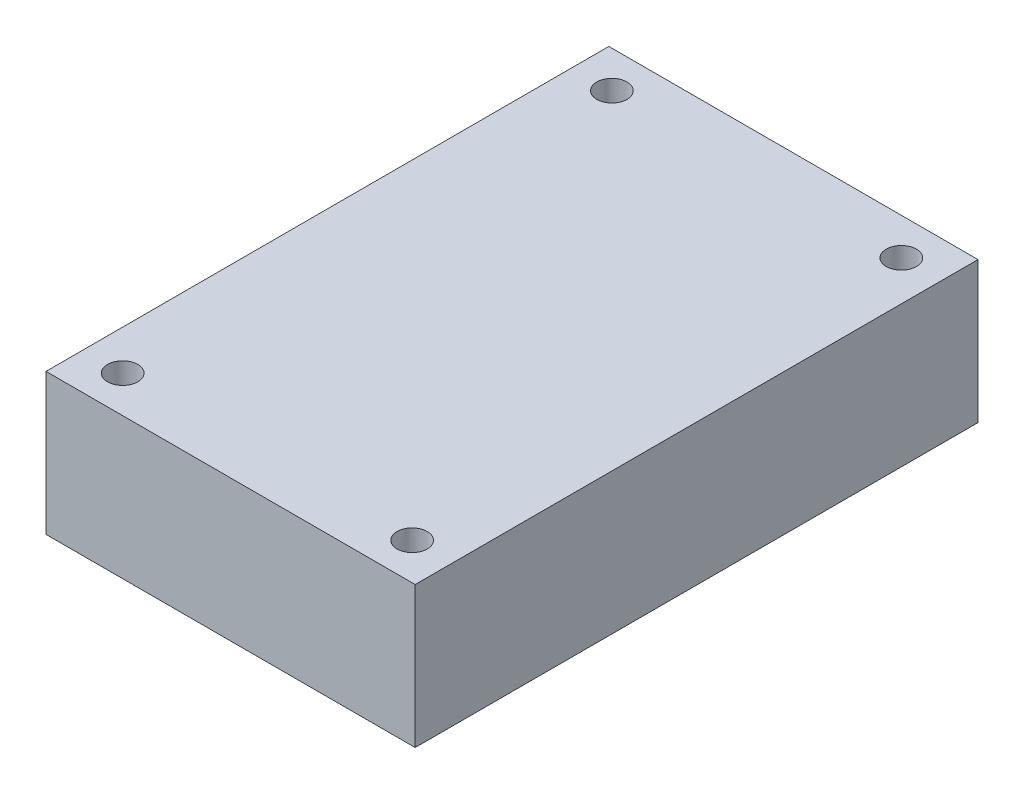
ISO-10303-21;
HEADER;
FILE_DESCRIPTION(('STEP AP214'),'2;1');
FILE_NAME('part.step','',(''),(''),'','','');
FILE_SCHEMA(('AUTOMOTIVE_DESIGN { 1 0 10303 214 1 1 1 1 }'));
ENDSEC;
DATA;
#1=APPLICATION_CONTEXT('core data for automotive mechanical design processes');
#2=APPLICATION_PROTOCOL_DEFINITION('international standard','automotive_design',2000,#1);
#3=PRODUCT_CONTEXT('',#1,'mechanical');
#4=PRODUCT('Part','Part','',(#3));
#5=PRODUCT_RELATED_PRODUCT_CATEGORY('part','',(#4));
#6=PRODUCT_DEFINITION_FORMATION('','',#4);
#7=PRODUCT_DEFINITION_CONTEXT('part definition',#1,'design');
#8=PRODUCT_DEFINITION('design','',#6,#7);
#9=PRODUCT_DEFINITION_SHAPE('','',#8);
#10=(LENGTH_UNIT() NAMED_UNIT(*) SI_UNIT(.MILLI.,.METRE.));
#11=(NAMED_UNIT(*) PLANE_ANGLE_UNIT() SI_UNIT($,.RADIAN.));
#12=(NAMED_UNIT(*) SI_UNIT($,.STERADIAN.) SOLID_ANGLE_UNIT());
#13=UNCERTAINTY_MEASURE_WITH_UNIT(LENGTH_MEASURE(1.E-05),#10,'distance_accuracy_value','');
#14=(GEOMETRIC_REPRESENTATION_CONTEXT(3) GLOBAL_UNCERTAINTY_ASSIGNED_CONTEXT((#13)) GLOBAL_UNIT_ASSIGNED_CONTEXT((#10,
#11,#12)) REPRESENTATION_CONTEXT('',''));
#15=CARTESIAN_POINT('',(0.,0.,0.));
#16=DIRECTION('',(0.,0.,1.));
#17=DIRECTION('',(1.,0.,0.));
#18=AXIS2_PLACEMENT_3D('',#15,#16,#17);
#19=CARTESIAN_POINT('',(18.3,14.,-27.9));
#20=DIRECTION('',(-1.,0.,0.));
#21=DIRECTION('',(0.,0.,1.));
#22=AXIS2_PLACEMENT_3D('',#19,#20,#21);
#23=PLANE('',#22);
#24=DIRECTION('',(0.,0.,-1.));
#25=VECTOR('',#24,1.);
#26=CARTESIAN_POINT('',(18.3,0.,-27.9));
#27=LINE('',#26,#25);
#28=CARTESIAN_POINT('',(18.3,0.,27.9));
#29=VERTEX_POINT('',#28);
#30=CARTESIAN_POINT('',(18.3,0.,-27.9));
#31=VERTEX_POINT('',#30);
#32=EDGE_CURVE('E104',#29,#31,#27,.T.);
#33=ORIENTED_EDGE('',*,*,#32,.T.);
#34=DIRECTION('',(0.,-1.,0.));
#35=VECTOR('',#34,1.);
#36=CARTESIAN_POINT('',(18.3,14.,-27.9));
#37=LINE('',#36,#35);
#38=CARTESIAN_POINT('',(18.3,14.,-27.9));
#39=VERTEX_POINT('',#38);
#40=EDGE_CURVE('E11',#39,#31,#37,.T.);
#41=ORIENTED_EDGE('',*,*,#40,.F.);
#42=DIRECTION('',(0.,0.,-1.));
#43=VECTOR('',#42,1.);
#44=CARTESIAN_POINT('',(18.3,14.,-27.9));
#45=LINE('',#44,#43);
#46=CARTESIAN_POINT('',(18.3,14.,27.9));
#47=VERTEX_POINT('',#46);
#48=EDGE_CURVE('E92',#47,#39,#45,.T.);
#49=ORIENTED_EDGE('',*,*,#48,.F.);
#50=DIRECTION('',(0.,-1.,0.));
#51=VECTOR('',#50,1.);
#52=CARTESIAN_POINT('',(18.3,14.,27.9));
#53=LINE('',#52,#51);
#54=EDGE_CURVE('E100',#47,#29,#53,.T.);
#55=ORIENTED_EDGE('',*,*,#54,.T.);
#56=EDGE_LOOP('',(#33,#41,#49,#55));
#57=FACE_BOUND('',#56,.T.);
#58=ADVANCED_FACE('F41',(#57),#23,.F.);
#59=CARTESIAN_POINT('',(-18.3,14.,-27.9));
#60=DIRECTION('',(0.,0.,1.));
#61=DIRECTION('',(1.,0.,0.));
#62=AXIS2_PLACEMENT_3D('',#59,#60,#61);
#63=PLANE('',#62);
#64=DIRECTION('',(-1.,0.,0.));
#65=VECTOR('',#64,1.);
#66=CARTESIAN_POINT('',(-18.3,0.,-27.9));
#67=LINE('',#66,#65);
#68=CARTESIAN_POINT('',(-18.3,0.,-27.9));
#69=VERTEX_POINT('',#68);
#70=EDGE_CURVE('E96',#31,#69,#67,.T.);
#71=ORIENTED_EDGE('',*,*,#70,.T.);
#72=DIRECTION('',(0.,-1.,0.));
#73=VECTOR('',#72,1.);
#74=CARTESIAN_POINT('',(-18.3,14.,-27.9));
#75=LINE('',#74,#73);
#76=CARTESIAN_POINT('',(-18.3,14.,-27.9));
#77=VERTEX_POINT('',#76);
#78=EDGE_CURVE('E49',#77,#69,#75,.T.);
#79=ORIENTED_EDGE('',*,*,#78,.F.);
#80=DIRECTION('',(-1.,0.,0.));
#81=VECTOR('',#80,1.);
#82=CARTESIAN_POINT('',(-18.3,14.,-27.9));
#83=LINE('',#82,#81);
#84=EDGE_CURVE('E87',#39,#77,#83,.T.);
#85=ORIENTED_EDGE('',*,*,#84,.F.);
#86=ORIENTED_EDGE('',*,*,#40,.T.);
#87=EDGE_LOOP('',(#71,#79,#85,#86));
#88=FACE_BOUND('',#87,.T.);
#89=ADVANCED_FACE('F95',(#88),#63,.F.);
#90=CARTESIAN_POINT('',(-18.3,14.,-27.9));
#91=DIRECTION('',(1.,0.,0.));
#92=DIRECTION('',(0.,0.,-1.));
#93=AXIS2_PLACEMENT_3D('',#90,#91,#92);
#94=PLANE('',#93);
#95=DIRECTION('',(0.,0.,1.));
#96=VECTOR('',#95,1.);
#97=CARTESIAN_POINT('',(-18.3,0.,-27.9));
#98=LINE('',#97,#96);
#99=CARTESIAN_POINT('',(-18.3,0.,27.9));
#100=VERTEX_POINT('',#99);
#101=EDGE_CURVE('E74',#69,#100,#98,.T.);
#102=ORIENTED_EDGE('',*,*,#101,.T.);
#103=DIRECTION('',(0.,-1.,0.));
#104=VECTOR('',#103,1.);
#105=CARTESIAN_POINT('',(-18.3,14.,27.9));
#106=LINE('',#105,#104);
#107=CARTESIAN_POINT('',(-18.3,14.,27.9));
#108=VERTEX_POINT('',#107);
#109=EDGE_CURVE('E97',#108,#100,#106,.T.);
#110=ORIENTED_EDGE('',*,*,#109,.F.);
#111=DIRECTION('',(0.,0.,1.));
#112=VECTOR('',#111,1.);
#113=CARTESIAN_POINT('',(-18.3,14.,-27.9));
#114=LINE('',#113,#112);
#115=EDGE_CURVE('E90',#77,#108,#114,.T.);
#116=ORIENTED_EDGE('',*,*,#115,.F.);
#117=ORIENTED_EDGE('',*,*,#78,.T.);
#118=EDGE_LOOP('',(#102,#110,#116,#117));
#119=FACE_BOUND('',#118,.T.);
#120=ADVANCED_FACE('F98',(#119),#94,.F.);
#121=CARTESIAN_POINT('',(-18.3,14.,27.9));
#122=DIRECTION('',(0.,0.,-1.));
#123=DIRECTION('',(-1.,0.,0.));
#124=AXIS2_PLACEMENT_3D('',#121,#122,#123);
#125=PLANE('',#124);
#126=DIRECTION('',(1.,0.,0.));
#127=VECTOR('',#126,1.);
#128=CARTESIAN_POINT('',(-18.3,0.,27.9));
#129=LINE('',#128,#127);
#130=EDGE_CURVE('E80',#100,#29,#129,.T.);
#131=ORIENTED_EDGE('',*,*,#130,.T.);
#132=ORIENTED_EDGE('',*,*,#54,.F.);
#133=DIRECTION('',(1.,0.,0.));
#134=VECTOR('',#133,1.);
#135=CARTESIAN_POINT('',(-18.3,14.,27.9));
#136=LINE('',#135,#134);
#137=EDGE_CURVE('E57',#108,#47,#136,.T.);
#138=ORIENTED_EDGE('',*,*,#137,.F.);
#139=ORIENTED_EDGE('',*,*,#109,.T.);
#140=EDGE_LOOP('',(#131,#132,#138,#139));
#141=FACE_BOUND('',#140,.T.);
#142=ADVANCED_FACE('F112',(#141),#125,.F.);
#143=CARTESIAN_POINT('',(0.,14.,0.));
#144=DIRECTION('',(0.,1.,0.));
#145=DIRECTION('',(0.,0.,1.));
#146=AXIS2_PLACEMENT_3D('',#143,#144,#145);
#147=PLANE('',#146);
#148=CARTESIAN_POINT('',(14.35,14.,-24.25));
#149=DIRECTION('',(0.,1.,0.));
#150=DIRECTION('',(0.,0.,-1.));
#151=AXIS2_PLACEMENT_3D('',#148,#149,#150);
#152=CIRCLE('',#151,1.5);
#153=CARTESIAN_POINT('',(14.35,14.,-25.75));
#154=VERTEX_POINT('',#153);
#155=EDGE_CURVE('E124',#154,#154,#152,.T.);
#156=ORIENTED_EDGE('',*,*,#155,.F.);
#157=EDGE_LOOP('',(#156));
#158=FACE_BOUND('',#157,.T.);
#159=CARTESIAN_POINT('',(14.35,14.,24.25));
#160=DIRECTION('',(0.,1.,0.));
#161=DIRECTION('',(0.,0.,1.));
#162=AXIS2_PLACEMENT_3D('',#159,#160,#161);
#163=CIRCLE('',#162,1.50000000000001);
#164=CARTESIAN_POINT('',(14.35,14.,25.75));
#165=VERTEX_POINT('',#164);
#166=EDGE_CURVE('E130',#165,#165,#163,.T.);
#167=ORIENTED_EDGE('',*,*,#166,.F.);
#168=EDGE_LOOP('',(#167));
#169=FACE_BOUND('',#168,.T.);
#170=CARTESIAN_POINT('',(-14.35,14.,24.25));
#171=DIRECTION('',(0.,1.,0.));
#172=DIRECTION('',(0.,0.,-1.));
#173=AXIS2_PLACEMENT_3D('',#170,#171,#172);
#174=CIRCLE('',#173,1.49999999999999);
#175=CARTESIAN_POINT('',(-14.35,14.,22.75));
#176=VERTEX_POINT('',#175);
#177=EDGE_CURVE('E136',#176,#176,#174,.T.);
#178=ORIENTED_EDGE('',*,*,#177,.F.);
#179=EDGE_LOOP('',(#178));
#180=FACE_BOUND('',#179,.T.);
#181=CARTESIAN_POINT('',(-14.35,14.,-24.25));
#182=DIRECTION('',(0.,1.,0.));
#183=DIRECTION('',(0.,0.,1.));
#184=AXIS2_PLACEMENT_3D('',#181,#182,#183);
#185=CIRCLE('',#184,1.5);
#186=CARTESIAN_POINT('',(-14.35,14.,-22.75));
#187=VERTEX_POINT('',#186);
#188=EDGE_CURVE('E107',#187,#187,#185,.T.);
#189=ORIENTED_EDGE('',*,*,#188,.F.);
#190=EDGE_LOOP('',(#189));
#191=FACE_BOUND('',#190,.T.);
#192=ORIENTED_EDGE('',*,*,#48,.T.);
#193=ORIENTED_EDGE('',*,*,#84,.T.);
#194=ORIENTED_EDGE('',*,*,#115,.T.);
#195=ORIENTED_EDGE('',*,*,#137,.T.);
#196=EDGE_LOOP('',(#192,#193,#194,#195));
#197=FACE_BOUND('',#196,.T.);
#198=ADVANCED_FACE('F88',(#158,#169,#180,#191,#197),#147,.T.);
#199=CARTESIAN_POINT('',(0.,0.,0.));
#200=DIRECTION('',(0.,1.,0.));
#201=DIRECTION('',(0.,0.,1.));
#202=AXIS2_PLACEMENT_3D('',#199,#200,#201);
#203=PLANE('',#202);
#204=CARTESIAN_POINT('',(14.35,0.,-24.25));
#205=DIRECTION('',(0.,1.,0.));
#206=DIRECTION('',(0.,0.,-1.));
#207=AXIS2_PLACEMENT_3D('',#204,#205,#206);
#208=CIRCLE('',#207,1.5);
#209=CARTESIAN_POINT('',(14.35,0.,-25.75));
#210=VERTEX_POINT('',#209);
#211=EDGE_CURVE('E127',#210,#210,#208,.T.);
#212=ORIENTED_EDGE('',*,*,#211,.T.);
#213=EDGE_LOOP('',(#212));
#214=FACE_BOUND('',#213,.T.);
#215=CARTESIAN_POINT('',(14.35,0.,24.25));
#216=DIRECTION('',(0.,1.,0.));
#217=DIRECTION('',(0.,0.,1.));
#218=AXIS2_PLACEMENT_3D('',#215,#216,#217);
#219=CIRCLE('',#218,1.50000000000001);
#220=CARTESIAN_POINT('',(14.35,0.,25.75));
#221=VERTEX_POINT('',#220);
#222=EDGE_CURVE('E133',#221,#221,#219,.T.);
#223=ORIENTED_EDGE('',*,*,#222,.T.);
#224=EDGE_LOOP('',(#223));
#225=FACE_BOUND('',#224,.T.);
#226=CARTESIAN_POINT('',(-14.35,0.,24.25));
#227=DIRECTION('',(0.,1.,0.));
#228=DIRECTION('',(0.,0.,-1.));
#229=AXIS2_PLACEMENT_3D('',#226,#227,#228);
#230=CIRCLE('',#229,1.49999999999999);
#231=CARTESIAN_POINT('',(-14.35,0.,22.75));
#232=VERTEX_POINT('',#231);
#233=EDGE_CURVE('E121',#232,#232,#230,.T.);
#234=ORIENTED_EDGE('',*,*,#233,.T.);
#235=EDGE_LOOP('',(#234));
#236=FACE_BOUND('',#235,.T.);
#237=CARTESIAN_POINT('',(-14.35,0.,-24.25));
#238=DIRECTION('',(0.,1.,0.));
#239=DIRECTION('',(0.,0.,1.));
#240=AXIS2_PLACEMENT_3D('',#237,#238,#239);
#241=CIRCLE('',#240,1.5);
#242=CARTESIAN_POINT('',(-14.35,0.,-22.75));
#243=VERTEX_POINT('',#242);
#244=EDGE_CURVE('E118',#243,#243,#241,.T.);
#245=ORIENTED_EDGE('',*,*,#244,.T.);
#246=EDGE_LOOP('',(#245));
#247=FACE_BOUND('',#246,.T.);
#248=ORIENTED_EDGE('',*,*,#32,.F.);
#249=ORIENTED_EDGE('',*,*,#130,.F.);
#250=ORIENTED_EDGE('',*,*,#101,.F.);
#251=ORIENTED_EDGE('',*,*,#70,.F.);
#252=EDGE_LOOP('',(#248,#249,#250,#251));
#253=FACE_BOUND('',#252,.T.);
#254=ADVANCED_FACE('F115',(#214,#225,#236,#247,#253),#203,.F.);
#255=CARTESIAN_POINT('',(-14.35,14.,-24.25));
#256=DIRECTION('',(0.,-1.,0.));
#257=DIRECTION('',(0.,0.,-1.));
#258=AXIS2_PLACEMENT_3D('',#255,#256,#257);
#259=CYLINDRICAL_SURFACE('',#258,1.5);
#260=ORIENTED_EDGE('',*,*,#188,.T.);
#261=EDGE_LOOP('',(#260));
#262=FACE_BOUND('',#261,.T.);
#263=ORIENTED_EDGE('',*,*,#244,.F.);
#264=EDGE_LOOP('',(#263));
#265=FACE_BOUND('',#264,.T.);
#266=ADVANCED_FACE('F147',(#262,#265),#259,.F.);
#267=CARTESIAN_POINT('',(-14.35,14.,24.25));
#268=DIRECTION('',(0.,-1.,0.));
#269=DIRECTION('',(0.,0.,-1.));
#270=AXIS2_PLACEMENT_3D('',#267,#268,#269);
#271=CYLINDRICAL_SURFACE('',#270,1.49999999999999);
#272=ORIENTED_EDGE('',*,*,#177,.T.);
#273=EDGE_LOOP('',(#272));
#274=FACE_BOUND('',#273,.T.);
#275=ORIENTED_EDGE('',*,*,#233,.F.);
#276=EDGE_LOOP('',(#275));
#277=FACE_BOUND('',#276,.T.);
#278=ADVANCED_FACE('F144',(#274,#277),#271,.F.);
#279=CARTESIAN_POINT('',(14.35,14.,24.25));
#280=DIRECTION('',(0.,-1.,0.));
#281=DIRECTION('',(0.,0.,-1.));
#282=AXIS2_PLACEMENT_3D('',#279,#280,#281);
#283=CYLINDRICAL_SURFACE('',#282,1.50000000000001);
#284=ORIENTED_EDGE('',*,*,#166,.T.);
#285=EDGE_LOOP('',(#284));
#286=FACE_BOUND('',#285,.T.);
#287=ORIENTED_EDGE('',*,*,#222,.F.);
#288=EDGE_LOOP('',(#287));
#289=FACE_BOUND('',#288,.T.);
#290=ADVANCED_FACE('F146',(#286,#289),#283,.F.);
#291=CARTESIAN_POINT('',(14.35,14.,-24.25));
#292=DIRECTION('',(0.,-1.,0.));
#293=DIRECTION('',(0.,0.,-1.));
#294=AXIS2_PLACEMENT_3D('',#291,#292,#293);
#295=CYLINDRICAL_SURFACE('',#294,1.5);
#296=ORIENTED_EDGE('',*,*,#155,.T.);
#297=EDGE_LOOP('',(#296));
#298=FACE_BOUND('',#297,.T.);
#299=ORIENTED_EDGE('',*,*,#211,.F.);
#300=EDGE_LOOP('',(#299));
#301=FACE_BOUND('',#300,.T.);
#302=ADVANCED_FACE('F154',(#298,#301),#295,.F.);
#303=CLOSED_SHELL('',(#58,#89,#120,#142,#198,#254,#266,#278,#290,#302));
#304=MANIFOLD_SOLID_BREP('B2',#303);
#305=ADVANCED_BREP_SHAPE_REPRESENTATION('',(#18,#304),#14);
#306=SHAPE_DEFINITION_REPRESENTATION(#9,#305);
ENDSEC;
END-ISO-10303-21;
